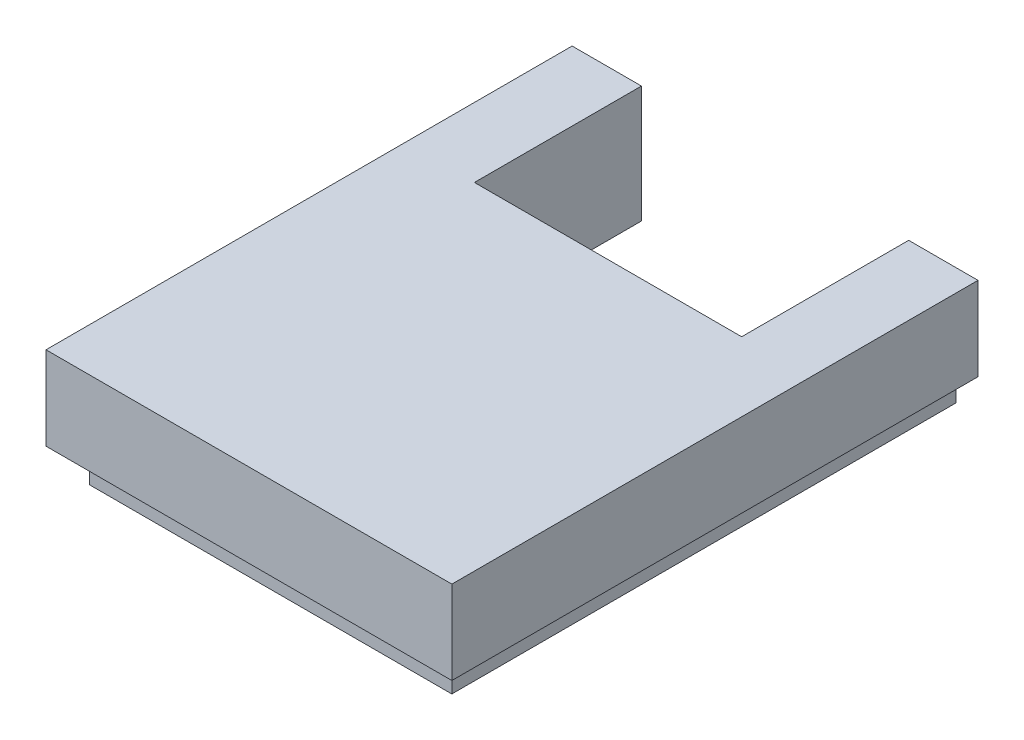
ISO-10303-21;
HEADER;
FILE_DESCRIPTION(('STEP AP214'),'2;1');
FILE_NAME('part.step','',(''),(''),'','','');
FILE_SCHEMA(('AUTOMOTIVE_DESIGN { 1 0 10303 214 1 1 1 1 }'));
ENDSEC;
DATA;
#1=APPLICATION_CONTEXT('core data for automotive mechanical design processes');
#2=APPLICATION_PROTOCOL_DEFINITION('international standard','automotive_design',2000,#1);
#3=PRODUCT_CONTEXT('',#1,'mechanical');
#4=PRODUCT('Part','Part','',(#3));
#5=PRODUCT_RELATED_PRODUCT_CATEGORY('part','',(#4));
#6=PRODUCT_DEFINITION_FORMATION('','',#4);
#7=PRODUCT_DEFINITION_CONTEXT('part definition',#1,'design');
#8=PRODUCT_DEFINITION('design','',#6,#7);
#9=PRODUCT_DEFINITION_SHAPE('','',#8);
#10=(LENGTH_UNIT() NAMED_UNIT(*) SI_UNIT(.MILLI.,.METRE.));
#11=(NAMED_UNIT(*) PLANE_ANGLE_UNIT() SI_UNIT($,.RADIAN.));
#12=(NAMED_UNIT(*) SI_UNIT($,.STERADIAN.) SOLID_ANGLE_UNIT());
#13=UNCERTAINTY_MEASURE_WITH_UNIT(LENGTH_MEASURE(1.E-05),#10,'distance_accuracy_value','');
#14=(GEOMETRIC_REPRESENTATION_CONTEXT(3) GLOBAL_UNCERTAINTY_ASSIGNED_CONTEXT((#13)) GLOBAL_UNIT_ASSIGNED_CONTEXT((#10,
#11,#12)) REPRESENTATION_CONTEXT('',''));
#15=CARTESIAN_POINT('',(0.,0.,0.));
#16=DIRECTION('',(0.,0.,1.));
#17=DIRECTION('',(1.,0.,0.));
#18=AXIS2_PLACEMENT_3D('',#15,#16,#17);
#19=CARTESIAN_POINT('',(308.61,177.8,-400.05));
#20=DIRECTION('',(-1.,0.,0.));
#21=DIRECTION('',(0.,0.,1.));
#22=AXIS2_PLACEMENT_3D('',#19,#20,#21);
#23=PLANE('',#22);
#24=DIRECTION('',(0.,-1.,0.));
#25=VECTOR('',#24,1.);
#26=CARTESIAN_POINT('',(308.61,177.8,400.05));
#27=LINE('',#26,#25);
#28=CARTESIAN_POINT('',(308.61,177.8,400.05));
#29=VERTEX_POINT('',#28);
#30=CARTESIAN_POINT('',(308.61,50.8,400.05));
#31=VERTEX_POINT('',#30);
#32=EDGE_CURVE('E128',#29,#31,#27,.T.);
#33=ORIENTED_EDGE('',*,*,#32,.T.);
#34=DIRECTION('',(0.,0.,1.));
#35=VECTOR('',#34,1.);
#36=CARTESIAN_POINT('',(308.61,50.8,400.05));
#37=LINE('',#36,#35);
#38=CARTESIAN_POINT('',(308.61,50.8,-400.05));
#39=VERTEX_POINT('',#38);
#40=EDGE_CURVE('E188',#39,#31,#37,.T.);
#41=ORIENTED_EDGE('',*,*,#40,.F.);
#42=DIRECTION('',(0.,-1.,0.));
#43=VECTOR('',#42,1.);
#44=CARTESIAN_POINT('',(308.61,177.8,-400.05));
#45=LINE('',#44,#43);
#46=CARTESIAN_POINT('',(308.61,177.8,-400.05));
#47=VERTEX_POINT('',#46);
#48=EDGE_CURVE('E11',#47,#39,#45,.T.);
#49=ORIENTED_EDGE('',*,*,#48,.F.);
#50=DIRECTION('',(0.,0.,-1.));
#51=VECTOR('',#50,1.);
#52=CARTESIAN_POINT('',(308.61,177.8,-400.05));
#53=LINE('',#52,#51);
#54=EDGE_CURVE('E142',#29,#47,#53,.T.);
#55=ORIENTED_EDGE('',*,*,#54,.F.);
#56=EDGE_LOOP('',(#33,#41,#49,#55));
#57=FACE_BOUND('',#56,.T.);
#58=ADVANCED_FACE('F33',(#57),#23,.F.);
#59=CARTESIAN_POINT('',(308.61,177.8,-400.05));
#60=DIRECTION('',(0.,0.,1.));
#61=DIRECTION('',(1.,0.,0.));
#62=AXIS2_PLACEMENT_3D('',#59,#60,#61);
#63=PLANE('',#62);
#64=DIRECTION('',(1.,0.,0.));
#65=VECTOR('',#64,1.);
#66=CARTESIAN_POINT('',(308.61,50.8,-400.05));
#67=LINE('',#66,#65);
#68=CARTESIAN_POINT('',(275.513805506208,50.8,-400.05));
#69=VERTEX_POINT('',#68);
#70=EDGE_CURVE('E177',#69,#39,#67,.T.);
#71=ORIENTED_EDGE('',*,*,#70,.F.);
#72=DIRECTION('',(0.,-1.,0.));
#73=VECTOR('',#72,1.);
#74=CARTESIAN_POINT('',(275.513805506208,50.8,-400.05));
#75=LINE('',#74,#73);
#76=CARTESIAN_POINT('',(275.513805506208,0.,-400.05));
#77=VERTEX_POINT('',#76);
#78=EDGE_CURVE('E135',#69,#77,#75,.T.);
#79=ORIENTED_EDGE('',*,*,#78,.T.);
#80=DIRECTION('',(-1.,0.,0.));
#81=VECTOR('',#80,1.);
#82=CARTESIAN_POINT('',(308.61,0.,-400.05));
#83=LINE('',#82,#81);
#84=CARTESIAN_POINT('',(203.2,0.,-400.05));
#85=VERTEX_POINT('',#84);
#86=EDGE_CURVE('E132',#77,#85,#83,.T.);
#87=ORIENTED_EDGE('',*,*,#86,.T.);
#88=DIRECTION('',(0.,-1.,0.));
#89=VECTOR('',#88,1.);
#90=CARTESIAN_POINT('',(203.2,177.8,-400.05));
#91=LINE('',#90,#89);
#92=CARTESIAN_POINT('',(203.2,177.8,-400.05));
#93=VERTEX_POINT('',#92);
#94=EDGE_CURVE('E40',#93,#85,#91,.T.);
#95=ORIENTED_EDGE('',*,*,#94,.F.);
#96=DIRECTION('',(-1.,0.,0.));
#97=VECTOR('',#96,1.);
#98=CARTESIAN_POINT('',(308.61,177.8,-400.05));
#99=LINE('',#98,#97);
#100=EDGE_CURVE('E86',#47,#93,#99,.T.);
#101=ORIENTED_EDGE('',*,*,#100,.F.);
#102=ORIENTED_EDGE('',*,*,#48,.T.);
#103=EDGE_LOOP('',(#71,#79,#87,#95,#101,#102));
#104=FACE_BOUND('',#103,.T.);
#105=ADVANCED_FACE('F226',(#104),#63,.F.);
#106=CARTESIAN_POINT('',(203.2,177.8,-400.05));
#107=DIRECTION('',(1.,0.,0.));
#108=DIRECTION('',(0.,0.,-1.));
#109=AXIS2_PLACEMENT_3D('',#106,#107,#108);
#110=PLANE('',#109);
#111=DIRECTION('',(0.,0.,1.));
#112=VECTOR('',#111,1.);
#113=CARTESIAN_POINT('',(203.2,0.,-400.05));
#114=LINE('',#113,#112);
#115=CARTESIAN_POINT('',(203.2,0.,-146.05));
#116=VERTEX_POINT('',#115);
#117=EDGE_CURVE('E134',#85,#116,#114,.T.);
#118=ORIENTED_EDGE('',*,*,#117,.T.);
#119=DIRECTION('',(0.,-1.,0.));
#120=VECTOR('',#119,1.);
#121=CARTESIAN_POINT('',(203.2,177.8,-146.05));
#122=LINE('',#121,#120);
#123=CARTESIAN_POINT('',(203.2,177.8,-146.05));
#124=VERTEX_POINT('',#123);
#125=EDGE_CURVE('E149',#124,#116,#122,.T.);
#126=ORIENTED_EDGE('',*,*,#125,.F.);
#127=DIRECTION('',(0.,0.,1.));
#128=VECTOR('',#127,1.);
#129=CARTESIAN_POINT('',(203.2,177.8,-400.05));
#130=LINE('',#129,#128);
#131=EDGE_CURVE('E157',#93,#124,#130,.T.);
#132=ORIENTED_EDGE('',*,*,#131,.F.);
#133=ORIENTED_EDGE('',*,*,#94,.T.);
#134=EDGE_LOOP('',(#118,#126,#132,#133));
#135=FACE_BOUND('',#134,.T.);
#136=ADVANCED_FACE('F155',(#135),#110,.F.);
#137=CARTESIAN_POINT('',(-203.2,177.8,-146.05));
#138=DIRECTION('',(0.,0.,1.));
#139=DIRECTION('',(1.,0.,0.));
#140=AXIS2_PLACEMENT_3D('',#137,#138,#139);
#141=PLANE('',#140);
#142=DIRECTION('',(-1.,0.,0.));
#143=VECTOR('',#142,1.);
#144=CARTESIAN_POINT('',(-203.2,0.,-146.05));
#145=LINE('',#144,#143);
#146=CARTESIAN_POINT('',(-203.2,0.,-146.05));
#147=VERTEX_POINT('',#146);
#148=EDGE_CURVE('E137',#116,#147,#145,.T.);
#149=ORIENTED_EDGE('',*,*,#148,.T.);
#150=DIRECTION('',(0.,-1.,0.));
#151=VECTOR('',#150,1.);
#152=CARTESIAN_POINT('',(-203.2,177.8,-146.05));
#153=LINE('',#152,#151);
#154=CARTESIAN_POINT('',(-203.2,177.8,-146.05));
#155=VERTEX_POINT('',#154);
#156=EDGE_CURVE('E147',#155,#147,#153,.T.);
#157=ORIENTED_EDGE('',*,*,#156,.F.);
#158=DIRECTION('',(-1.,0.,0.));
#159=VECTOR('',#158,1.);
#160=CARTESIAN_POINT('',(-203.2,177.8,-146.05));
#161=LINE('',#160,#159);
#162=EDGE_CURVE('E169',#124,#155,#161,.T.);
#163=ORIENTED_EDGE('',*,*,#162,.F.);
#164=ORIENTED_EDGE('',*,*,#125,.T.);
#165=EDGE_LOOP('',(#149,#157,#163,#164));
#166=FACE_BOUND('',#165,.T.);
#167=ADVANCED_FACE('F166',(#166),#141,.F.);
#168=CARTESIAN_POINT('',(-203.2,177.8,-400.05));
#169=DIRECTION('',(-1.,0.,0.));
#170=DIRECTION('',(0.,0.,1.));
#171=AXIS2_PLACEMENT_3D('',#168,#169,#170);
#172=PLANE('',#171);
#173=DIRECTION('',(0.,0.,-1.));
#174=VECTOR('',#173,1.);
#175=CARTESIAN_POINT('',(-203.2,0.,-400.05));
#176=LINE('',#175,#174);
#177=CARTESIAN_POINT('',(-203.2,0.,-400.05));
#178=VERTEX_POINT('',#177);
#179=EDGE_CURVE('E78',#147,#178,#176,.T.);
#180=ORIENTED_EDGE('',*,*,#179,.T.);
#181=DIRECTION('',(0.,-1.,0.));
#182=VECTOR('',#181,1.);
#183=CARTESIAN_POINT('',(-203.2,177.8,-400.05));
#184=LINE('',#183,#182);
#185=CARTESIAN_POINT('',(-203.2,177.8,-400.05));
#186=VERTEX_POINT('',#185);
#187=EDGE_CURVE('E122',#186,#178,#184,.T.);
#188=ORIENTED_EDGE('',*,*,#187,.F.);
#189=DIRECTION('',(0.,0.,-1.));
#190=VECTOR('',#189,1.);
#191=CARTESIAN_POINT('',(-203.2,177.8,-400.05));
#192=LINE('',#191,#190);
#193=EDGE_CURVE('E109',#155,#186,#192,.T.);
#194=ORIENTED_EDGE('',*,*,#193,.F.);
#195=ORIENTED_EDGE('',*,*,#156,.T.);
#196=EDGE_LOOP('',(#180,#188,#194,#195));
#197=FACE_BOUND('',#196,.T.);
#198=ADVANCED_FACE('F168',(#197),#172,.F.);
#199=CARTESIAN_POINT('',(-203.2,177.8,-400.05));
#200=DIRECTION('',(0.,0.,1.));
#201=DIRECTION('',(1.,0.,0.));
#202=AXIS2_PLACEMENT_3D('',#199,#200,#201);
#203=PLANE('',#202);
#204=DIRECTION('',(-1.,0.,0.));
#205=VECTOR('',#204,1.);
#206=CARTESIAN_POINT('',(-203.2,0.,-400.05));
#207=LINE('',#206,#205);
#208=CARTESIAN_POINT('',(-275.68275931371,0.,-400.05));
#209=VERTEX_POINT('',#208);
#210=EDGE_CURVE('E140',#178,#209,#207,.T.);
#211=ORIENTED_EDGE('',*,*,#210,.T.);
#212=DIRECTION('',(0.,-1.,0.));
#213=VECTOR('',#212,1.);
#214=CARTESIAN_POINT('',(-275.68275931371,50.8,-400.05));
#215=LINE('',#214,#213);
#216=CARTESIAN_POINT('',(-275.68275931371,50.8,-400.05));
#217=VERTEX_POINT('',#216);
#218=EDGE_CURVE('E47',#217,#209,#215,.T.);
#219=ORIENTED_EDGE('',*,*,#218,.F.);
#220=DIRECTION('',(1.,0.,0.));
#221=VECTOR('',#220,1.);
#222=CARTESIAN_POINT('',(-308.61,50.8,-400.05));
#223=LINE('',#222,#221);
#224=CARTESIAN_POINT('',(-308.61,50.8,-400.05));
#225=VERTEX_POINT('',#224);
#226=EDGE_CURVE('E119',#225,#217,#223,.T.);
#227=ORIENTED_EDGE('',*,*,#226,.F.);
#228=DIRECTION('',(0.,-1.,0.));
#229=VECTOR('',#228,1.);
#230=CARTESIAN_POINT('',(-308.61,177.8,-400.05));
#231=LINE('',#230,#229);
#232=CARTESIAN_POINT('',(-308.61,177.8,-400.05));
#233=VERTEX_POINT('',#232);
#234=EDGE_CURVE('E114',#233,#225,#231,.T.);
#235=ORIENTED_EDGE('',*,*,#234,.F.);
#236=DIRECTION('',(-1.,0.,0.));
#237=VECTOR('',#236,1.);
#238=CARTESIAN_POINT('',(-203.2,177.8,-400.05));
#239=LINE('',#238,#237);
#240=EDGE_CURVE('E102',#186,#233,#239,.T.);
#241=ORIENTED_EDGE('',*,*,#240,.F.);
#242=ORIENTED_EDGE('',*,*,#187,.T.);
#243=EDGE_LOOP('',(#211,#219,#227,#235,#241,#242));
#244=FACE_BOUND('',#243,.T.);
#245=ADVANCED_FACE('F116',(#244),#203,.F.);
#246=CARTESIAN_POINT('',(-308.61,177.8,-400.05));
#247=DIRECTION('',(1.,0.,0.));
#248=DIRECTION('',(0.,0.,-1.));
#249=AXIS2_PLACEMENT_3D('',#246,#247,#248);
#250=PLANE('',#249);
#251=ORIENTED_EDGE('',*,*,#234,.T.);
#252=DIRECTION('',(0.,0.,-1.));
#253=VECTOR('',#252,1.);
#254=CARTESIAN_POINT('',(-308.61,50.8,400.05));
#255=LINE('',#254,#253);
#256=CARTESIAN_POINT('',(-308.61,50.8,400.05));
#257=VERTEX_POINT('',#256);
#258=EDGE_CURVE('E206',#257,#225,#255,.T.);
#259=ORIENTED_EDGE('',*,*,#258,.F.);
#260=DIRECTION('',(0.,-1.,0.));
#261=VECTOR('',#260,1.);
#262=CARTESIAN_POINT('',(-308.61,177.8,400.05));
#263=LINE('',#262,#261);
#264=CARTESIAN_POINT('',(-308.61,177.8,400.05));
#265=VERTEX_POINT('',#264);
#266=EDGE_CURVE('E123',#265,#257,#263,.T.);
#267=ORIENTED_EDGE('',*,*,#266,.F.);
#268=DIRECTION('',(0.,0.,1.));
#269=VECTOR('',#268,1.);
#270=CARTESIAN_POINT('',(-308.61,177.8,-400.05));
#271=LINE('',#270,#269);
#272=EDGE_CURVE('E106',#233,#265,#271,.T.);
#273=ORIENTED_EDGE('',*,*,#272,.F.);
#274=EDGE_LOOP('',(#251,#259,#267,#273));
#275=FACE_BOUND('',#274,.T.);
#276=ADVANCED_FACE('F125',(#275),#250,.F.);
#277=CARTESIAN_POINT('',(-308.61,177.8,400.05));
#278=DIRECTION('',(0.,0.,-1.));
#279=DIRECTION('',(-1.,0.,0.));
#280=AXIS2_PLACEMENT_3D('',#277,#278,#279);
#281=PLANE('',#280);
#282=ORIENTED_EDGE('',*,*,#266,.T.);
#283=DIRECTION('',(-1.,0.,0.));
#284=VECTOR('',#283,1.);
#285=CARTESIAN_POINT('',(275.513805506208,50.8,400.05));
#286=LINE('',#285,#284);
#287=EDGE_CURVE('E209',#31,#257,#286,.T.);
#288=ORIENTED_EDGE('',*,*,#287,.F.);
#289=ORIENTED_EDGE('',*,*,#32,.F.);
#290=DIRECTION('',(1.,0.,0.));
#291=VECTOR('',#290,1.);
#292=CARTESIAN_POINT('',(-308.61,177.8,400.05));
#293=LINE('',#292,#291);
#294=EDGE_CURVE('E56',#265,#29,#293,.T.);
#295=ORIENTED_EDGE('',*,*,#294,.F.);
#296=EDGE_LOOP('',(#282,#288,#289,#295));
#297=FACE_BOUND('',#296,.T.);
#298=ADVANCED_FACE('F224',(#297),#281,.F.);
#299=CARTESIAN_POINT('',(0.,177.8,0.));
#300=DIRECTION('',(0.,1.,0.));
#301=DIRECTION('',(0.,0.,1.));
#302=AXIS2_PLACEMENT_3D('',#299,#300,#301);
#303=PLANE('',#302);
#304=ORIENTED_EDGE('',*,*,#54,.T.);
#305=ORIENTED_EDGE('',*,*,#100,.T.);
#306=ORIENTED_EDGE('',*,*,#131,.T.);
#307=ORIENTED_EDGE('',*,*,#162,.T.);
#308=ORIENTED_EDGE('',*,*,#193,.T.);
#309=ORIENTED_EDGE('',*,*,#240,.T.);
#310=ORIENTED_EDGE('',*,*,#272,.T.);
#311=ORIENTED_EDGE('',*,*,#294,.T.);
#312=EDGE_LOOP('',(#304,#305,#306,#307,#308,#309,#310,#311));
#313=FACE_BOUND('',#312,.T.);
#314=ADVANCED_FACE('F104',(#313),#303,.T.);
#315=CARTESIAN_POINT('',(0.,0.,0.));
#316=DIRECTION('',(0.,1.,0.));
#317=DIRECTION('',(0.,0.,1.));
#318=AXIS2_PLACEMENT_3D('',#315,#316,#317);
#319=PLANE('',#318);
#320=ORIENTED_EDGE('',*,*,#86,.F.);
#321=DIRECTION('',(0.,0.,-1.));
#322=VECTOR('',#321,1.);
#323=CARTESIAN_POINT('',(275.513805506208,0.,-400.05));
#324=LINE('',#323,#322);
#325=CARTESIAN_POINT('',(275.513805506208,0.,367.013597839048));
#326=VERTEX_POINT('',#325);
#327=EDGE_CURVE('E185',#326,#77,#324,.T.);
#328=ORIENTED_EDGE('',*,*,#327,.F.);
#329=DIRECTION('',(1.,0.,0.));
#330=VECTOR('',#329,1.);
#331=CARTESIAN_POINT('',(275.513805506208,0.,367.013597839048));
#332=LINE('',#331,#330);
#333=CARTESIAN_POINT('',(-275.68275931371,0.,367.013597839048));
#334=VERTEX_POINT('',#333);
#335=EDGE_CURVE('E189',#334,#326,#332,.T.);
#336=ORIENTED_EDGE('',*,*,#335,.F.);
#337=DIRECTION('',(0.,0.,1.));
#338=VECTOR('',#337,1.);
#339=CARTESIAN_POINT('',(-275.68275931371,0.,-400.05));
#340=LINE('',#339,#338);
#341=EDGE_CURVE('E192',#209,#334,#340,.T.);
#342=ORIENTED_EDGE('',*,*,#341,.F.);
#343=ORIENTED_EDGE('',*,*,#210,.F.);
#344=ORIENTED_EDGE('',*,*,#179,.F.);
#345=ORIENTED_EDGE('',*,*,#148,.F.);
#346=ORIENTED_EDGE('',*,*,#117,.F.);
#347=EDGE_LOOP('',(#320,#328,#336,#342,#343,#344,#345,#346));
#348=FACE_BOUND('',#347,.T.);
#349=ADVANCED_FACE('F161',(#348),#319,.F.);
#350=CARTESIAN_POINT('',(275.513805506208,50.8,-400.05));
#351=DIRECTION('',(-1.,0.,0.));
#352=DIRECTION('',(0.,0.,1.));
#353=AXIS2_PLACEMENT_3D('',#350,#351,#352);
#354=PLANE('',#353);
#355=ORIENTED_EDGE('',*,*,#327,.T.);
#356=ORIENTED_EDGE('',*,*,#78,.F.);
#357=DIRECTION('',(0.,0.,-1.));
#358=VECTOR('',#357,1.);
#359=CARTESIAN_POINT('',(275.513805506208,50.8,-400.05));
#360=LINE('',#359,#358);
#361=CARTESIAN_POINT('',(275.513805506208,50.8,367.013597839048));
#362=VERTEX_POINT('',#361);
#363=EDGE_CURVE('E196',#362,#69,#360,.T.);
#364=ORIENTED_EDGE('',*,*,#363,.F.);
#365=DIRECTION('',(0.,-1.,0.));
#366=VECTOR('',#365,1.);
#367=CARTESIAN_POINT('',(275.513805506208,50.8,367.013597839048));
#368=LINE('',#367,#366);
#369=EDGE_CURVE('E180',#362,#326,#368,.T.);
#370=ORIENTED_EDGE('',*,*,#369,.T.);
#371=EDGE_LOOP('',(#355,#356,#364,#370));
#372=FACE_BOUND('',#371,.T.);
#373=ADVANCED_FACE('F239',(#372),#354,.F.);
#374=CARTESIAN_POINT('',(275.513805506208,50.8,367.013597839048));
#375=DIRECTION('',(0.,0.,-1.));
#376=DIRECTION('',(-1.,0.,0.));
#377=AXIS2_PLACEMENT_3D('',#374,#375,#376);
#378=PLANE('',#377);
#379=ORIENTED_EDGE('',*,*,#335,.T.);
#380=ORIENTED_EDGE('',*,*,#369,.F.);
#381=DIRECTION('',(1.,0.,0.));
#382=VECTOR('',#381,1.);
#383=CARTESIAN_POINT('',(275.513805506208,50.8,367.013597839048));
#384=LINE('',#383,#382);
#385=CARTESIAN_POINT('',(-275.68275931371,50.8,367.013597839048));
#386=VERTEX_POINT('',#385);
#387=EDGE_CURVE('E199',#386,#362,#384,.T.);
#388=ORIENTED_EDGE('',*,*,#387,.F.);
#389=DIRECTION('',(0.,-1.,0.));
#390=VECTOR('',#389,1.);
#391=CARTESIAN_POINT('',(-275.68275931371,50.8,367.013597839048));
#392=LINE('',#391,#390);
#393=EDGE_CURVE('E176',#386,#334,#392,.T.);
#394=ORIENTED_EDGE('',*,*,#393,.T.);
#395=EDGE_LOOP('',(#379,#380,#388,#394));
#396=FACE_BOUND('',#395,.T.);
#397=ADVANCED_FACE('F242',(#396),#378,.F.);
#398=CARTESIAN_POINT('',(-275.68275931371,50.8,-400.05));
#399=DIRECTION('',(1.,0.,0.));
#400=DIRECTION('',(0.,0.,-1.));
#401=AXIS2_PLACEMENT_3D('',#398,#399,#400);
#402=PLANE('',#401);
#403=ORIENTED_EDGE('',*,*,#341,.T.);
#404=ORIENTED_EDGE('',*,*,#393,.F.);
#405=DIRECTION('',(0.,0.,1.));
#406=VECTOR('',#405,1.);
#407=CARTESIAN_POINT('',(-275.68275931371,50.8,-400.05));
#408=LINE('',#407,#406);
#409=EDGE_CURVE('E202',#217,#386,#408,.T.);
#410=ORIENTED_EDGE('',*,*,#409,.F.);
#411=ORIENTED_EDGE('',*,*,#218,.T.);
#412=EDGE_LOOP('',(#403,#404,#410,#411));
#413=FACE_BOUND('',#412,.T.);
#414=ADVANCED_FACE('F246',(#413),#402,.F.);
#415=CARTESIAN_POINT('',(0.,50.8,0.));
#416=DIRECTION('',(0.,1.,0.));
#417=DIRECTION('',(0.,0.,1.));
#418=AXIS2_PLACEMENT_3D('',#415,#416,#417);
#419=PLANE('',#418);
#420=ORIENTED_EDGE('',*,*,#40,.T.);
#421=ORIENTED_EDGE('',*,*,#287,.T.);
#422=ORIENTED_EDGE('',*,*,#258,.T.);
#423=ORIENTED_EDGE('',*,*,#226,.T.);
#424=ORIENTED_EDGE('',*,*,#409,.T.);
#425=ORIENTED_EDGE('',*,*,#387,.T.);
#426=ORIENTED_EDGE('',*,*,#363,.T.);
#427=ORIENTED_EDGE('',*,*,#70,.T.);
#428=EDGE_LOOP('',(#420,#421,#422,#423,#424,#425,#426,#427));
#429=FACE_BOUND('',#428,.T.);
#430=ADVANCED_FACE('F217',(#429),#419,.F.);
#431=CLOSED_SHELL('',(#58,#105,#136,#167,#198,#245,#276,#298,#314,#349,#373,#397,#414,#430));
#432=MANIFOLD_SOLID_BREP('B2',#431);
#433=ADVANCED_BREP_SHAPE_REPRESENTATION('',(#18,#432),#14);
#434=SHAPE_DEFINITION_REPRESENTATION(#9,#433);
ENDSEC;
END-ISO-10303-21;
